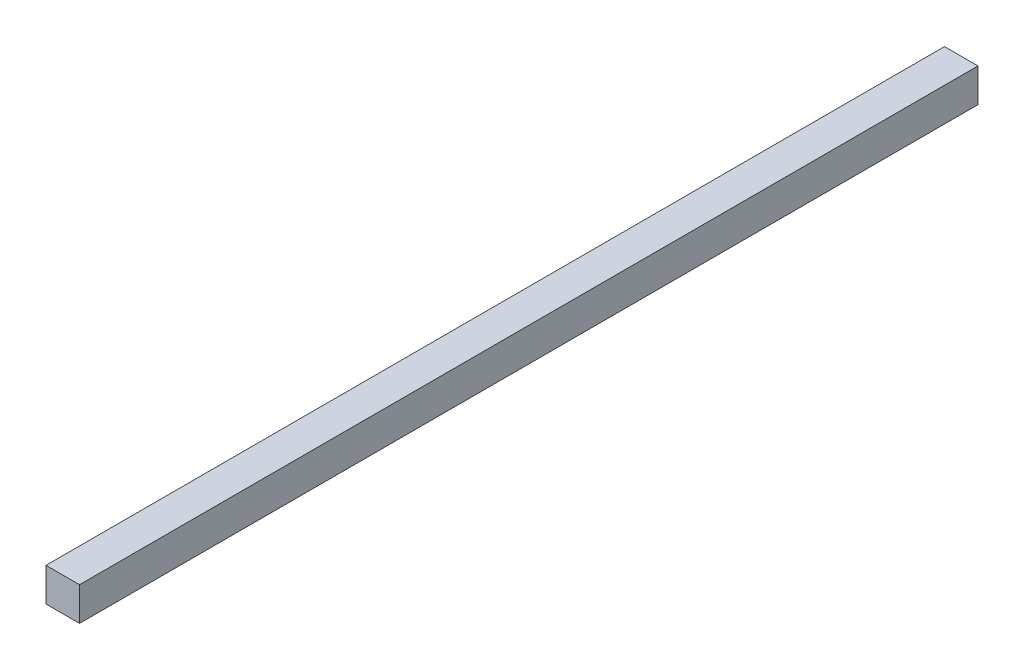
ISO-10303-21;
HEADER;
FILE_DESCRIPTION(('STEP AP214'),'2;1');
FILE_NAME('part.step','',(''),(''),'','','');
FILE_SCHEMA(('AUTOMOTIVE_DESIGN { 1 0 10303 214 1 1 1 1 }'));
ENDSEC;
DATA;
#1=APPLICATION_CONTEXT('core data for automotive mechanical design processes');
#2=APPLICATION_PROTOCOL_DEFINITION('international standard','automotive_design',2000,#1);
#3=PRODUCT_CONTEXT('',#1,'mechanical');
#4=PRODUCT('Part','Part','',(#3));
#5=PRODUCT_RELATED_PRODUCT_CATEGORY('part','',(#4));
#6=PRODUCT_DEFINITION_FORMATION('','',#4);
#7=PRODUCT_DEFINITION_CONTEXT('part definition',#1,'design');
#8=PRODUCT_DEFINITION('design','',#6,#7);
#9=PRODUCT_DEFINITION_SHAPE('','',#8);
#10=(LENGTH_UNIT() NAMED_UNIT(*) SI_UNIT(.MILLI.,.METRE.));
#11=(NAMED_UNIT(*) PLANE_ANGLE_UNIT() SI_UNIT($,.RADIAN.));
#12=(NAMED_UNIT(*) SI_UNIT($,.STERADIAN.) SOLID_ANGLE_UNIT());
#13=UNCERTAINTY_MEASURE_WITH_UNIT(LENGTH_MEASURE(1.E-05),#10,'distance_accuracy_value','');
#14=(GEOMETRIC_REPRESENTATION_CONTEXT(3) GLOBAL_UNCERTAINTY_ASSIGNED_CONTEXT((#13)) GLOBAL_UNIT_ASSIGNED_CONTEXT((#10,
#11,#12)) REPRESENTATION_CONTEXT('',''));
#15=CARTESIAN_POINT('',(0.,0.,0.));
#16=DIRECTION('',(0.,0.,1.));
#17=DIRECTION('',(1.,0.,0.));
#18=AXIS2_PLACEMENT_3D('',#15,#16,#17);
#19=CARTESIAN_POINT('',(1.41224,1.41224,0.));
#20=DIRECTION('',(0.,0.,-1.));
#21=DIRECTION('',(-1.,0.,0.));
#22=AXIS2_PLACEMENT_3D('',#19,#20,#21);
#23=PLANE('',#22);
#24=DIRECTION('',(0.,-1.,0.));
#25=VECTOR('',#24,1.);
#26=CARTESIAN_POINT('',(0.,1.41224,0.));
#27=LINE('',#26,#25);
#28=CARTESIAN_POINT('',(0.,1.41224,0.));
#29=VERTEX_POINT('',#28);
#30=CARTESIAN_POINT('',(0.,0.,0.));
#31=VERTEX_POINT('',#30);
#32=EDGE_CURVE('E107',#29,#31,#27,.T.);
#33=ORIENTED_EDGE('',*,*,#32,.T.);
#34=DIRECTION('',(-1.,0.,0.));
#35=VECTOR('',#34,1.);
#36=CARTESIAN_POINT('',(1.41224,0.,0.));
#37=LINE('',#36,#35);
#38=CARTESIAN_POINT('',(1.41224,0.,0.));
#39=VERTEX_POINT('',#38);
#40=EDGE_CURVE('E11',#39,#31,#37,.T.);
#41=ORIENTED_EDGE('',*,*,#40,.F.);
#42=DIRECTION('',(0.,-1.,0.));
#43=VECTOR('',#42,1.);
#44=CARTESIAN_POINT('',(1.41224,1.41224,0.));
#45=LINE('',#44,#43);
#46=CARTESIAN_POINT('',(1.41224,1.41224,0.));
#47=VERTEX_POINT('',#46);
#48=EDGE_CURVE('E91',#47,#39,#45,.T.);
#49=ORIENTED_EDGE('',*,*,#48,.F.);
#50=DIRECTION('',(-1.,0.,0.));
#51=VECTOR('',#50,1.);
#52=CARTESIAN_POINT('',(1.41224,1.41224,0.));
#53=LINE('',#52,#51);
#54=EDGE_CURVE('E103',#47,#29,#53,.T.);
#55=ORIENTED_EDGE('',*,*,#54,.T.);
#56=EDGE_LOOP('',(#33,#41,#49,#55));
#57=FACE_BOUND('',#56,.T.);
#58=ADVANCED_FACE('F39',(#57),#23,.F.);
#59=CARTESIAN_POINT('',(1.41224,0.,0.));
#60=DIRECTION('',(0.,1.,0.));
#61=DIRECTION('',(0.,0.,1.));
#62=AXIS2_PLACEMENT_3D('',#59,#60,#61);
#63=PLANE('',#62);
#64=DIRECTION('',(0.,0.,-1.));
#65=VECTOR('',#64,1.);
#66=CARTESIAN_POINT('',(0.,0.,0.));
#67=LINE('',#66,#65);
#68=CARTESIAN_POINT('',(0.,0.,-37.85108));
#69=VERTEX_POINT('',#68);
#70=EDGE_CURVE('E96',#31,#69,#67,.T.);
#71=ORIENTED_EDGE('',*,*,#70,.T.);
#72=DIRECTION('',(-1.,0.,0.));
#73=VECTOR('',#72,1.);
#74=CARTESIAN_POINT('',(1.41224,0.,-37.85108));
#75=LINE('',#74,#73);
#76=CARTESIAN_POINT('',(1.41224,0.,-37.85108));
#77=VERTEX_POINT('',#76);
#78=EDGE_CURVE('E48',#77,#69,#75,.T.);
#79=ORIENTED_EDGE('',*,*,#78,.F.);
#80=DIRECTION('',(0.,0.,-1.));
#81=VECTOR('',#80,1.);
#82=CARTESIAN_POINT('',(1.41224,0.,0.));
#83=LINE('',#82,#81);
#84=EDGE_CURVE('E86',#39,#77,#83,.T.);
#85=ORIENTED_EDGE('',*,*,#84,.F.);
#86=ORIENTED_EDGE('',*,*,#40,.T.);
#87=EDGE_LOOP('',(#71,#79,#85,#86));
#88=FACE_BOUND('',#87,.T.);
#89=ADVANCED_FACE('F95',(#88),#63,.F.);
#90=CARTESIAN_POINT('',(1.41224,0.,-37.85108));
#91=DIRECTION('',(0.,0.,1.));
#92=DIRECTION('',(1.,0.,0.));
#93=AXIS2_PLACEMENT_3D('',#90,#91,#92);
#94=PLANE('',#93);
#95=DIRECTION('',(0.,1.,0.));
#96=VECTOR('',#95,1.);
#97=CARTESIAN_POINT('',(0.,0.,-37.85108));
#98=LINE('',#97,#96);
#99=CARTESIAN_POINT('',(0.,1.41224,-37.85108));
#100=VERTEX_POINT('',#99);
#101=EDGE_CURVE('E73',#69,#100,#98,.T.);
#102=ORIENTED_EDGE('',*,*,#101,.T.);
#103=DIRECTION('',(-1.,0.,0.));
#104=VECTOR('',#103,1.);
#105=CARTESIAN_POINT('',(1.41224,1.41224,-37.85108));
#106=LINE('',#105,#104);
#107=CARTESIAN_POINT('',(1.41224,1.41224,-37.85108));
#108=VERTEX_POINT('',#107);
#109=EDGE_CURVE('E98',#108,#100,#106,.T.);
#110=ORIENTED_EDGE('',*,*,#109,.F.);
#111=DIRECTION('',(0.,1.,0.));
#112=VECTOR('',#111,1.);
#113=CARTESIAN_POINT('',(1.41224,0.,-37.85108));
#114=LINE('',#113,#112);
#115=EDGE_CURVE('E89',#77,#108,#114,.T.);
#116=ORIENTED_EDGE('',*,*,#115,.F.);
#117=ORIENTED_EDGE('',*,*,#78,.T.);
#118=EDGE_LOOP('',(#102,#110,#116,#117));
#119=FACE_BOUND('',#118,.T.);
#120=ADVANCED_FACE('F99',(#119),#94,.F.);
#121=CARTESIAN_POINT('',(1.41224,1.41224,-37.85108));
#122=DIRECTION('',(0.,-1.,0.));
#123=DIRECTION('',(0.,0.,-1.));
#124=AXIS2_PLACEMENT_3D('',#121,#122,#123);
#125=PLANE('',#124);
#126=DIRECTION('',(0.,0.,1.));
#127=VECTOR('',#126,1.);
#128=CARTESIAN_POINT('',(0.,1.41224,-37.85108));
#129=LINE('',#128,#127);
#130=EDGE_CURVE('E79',#100,#29,#129,.T.);
#131=ORIENTED_EDGE('',*,*,#130,.T.);
#132=ORIENTED_EDGE('',*,*,#54,.F.);
#133=DIRECTION('',(0.,0.,1.));
#134=VECTOR('',#133,1.);
#135=CARTESIAN_POINT('',(1.41224,1.41224,-37.85108));
#136=LINE('',#135,#134);
#137=EDGE_CURVE('E56',#108,#47,#136,.T.);
#138=ORIENTED_EDGE('',*,*,#137,.F.);
#139=ORIENTED_EDGE('',*,*,#109,.T.);
#140=EDGE_LOOP('',(#131,#132,#138,#139));
#141=FACE_BOUND('',#140,.T.);
#142=ADVANCED_FACE('F120',(#141),#125,.F.);
#143=CARTESIAN_POINT('',(1.41224,0.,0.));
#144=DIRECTION('',(1.,0.,0.));
#145=DIRECTION('',(0.,0.,-1.));
#146=AXIS2_PLACEMENT_3D('',#143,#144,#145);
#147=PLANE('',#146);
#148=ORIENTED_EDGE('',*,*,#48,.T.);
#149=ORIENTED_EDGE('',*,*,#84,.T.);
#150=ORIENTED_EDGE('',*,*,#115,.T.);
#151=ORIENTED_EDGE('',*,*,#137,.T.);
#152=EDGE_LOOP('',(#148,#149,#150,#151));
#153=FACE_BOUND('',#152,.T.);
#154=ADVANCED_FACE('F87',(#153),#147,.T.);
#155=CARTESIAN_POINT('',(0.,0.,0.));
#156=DIRECTION('',(1.,0.,0.));
#157=DIRECTION('',(0.,0.,-1.));
#158=AXIS2_PLACEMENT_3D('',#155,#156,#157);
#159=PLANE('',#158);
#160=ORIENTED_EDGE('',*,*,#32,.F.);
#161=ORIENTED_EDGE('',*,*,#130,.F.);
#162=ORIENTED_EDGE('',*,*,#101,.F.);
#163=ORIENTED_EDGE('',*,*,#70,.F.);
#164=EDGE_LOOP('',(#160,#161,#162,#163));
#165=FACE_BOUND('',#164,.T.);
#166=ADVANCED_FACE('F123',(#165),#159,.F.);
#167=CLOSED_SHELL('',(#58,#89,#120,#142,#154,#166));
#168=MANIFOLD_SOLID_BREP('B2',#167);
#169=ADVANCED_BREP_SHAPE_REPRESENTATION('',(#18,#168),#14);
#170=SHAPE_DEFINITION_REPRESENTATION(#9,#169);
ENDSEC;
END-ISO-10303-21;
